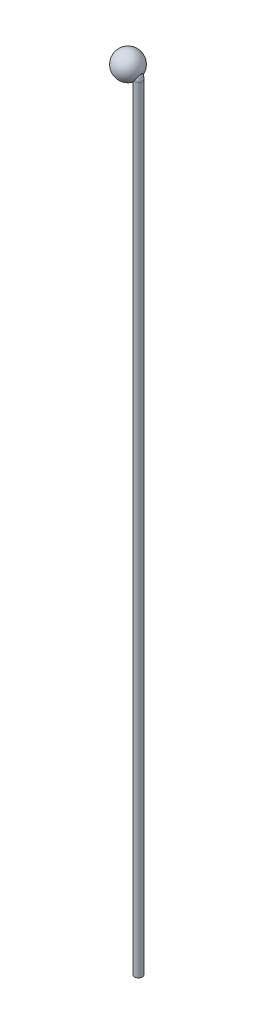
ISO-10303-21;
HEADER;
FILE_DESCRIPTION(('STEP AP214'),'2;1');
FILE_NAME('part.step','',(''),(''),'','','');
FILE_SCHEMA(('AUTOMOTIVE_DESIGN { 1 0 10303 214 1 1 1 1 }'));
ENDSEC;
DATA;
#1=APPLICATION_CONTEXT('core data for automotive mechanical design processes');
#2=APPLICATION_PROTOCOL_DEFINITION('international standard','automotive_design',2000,#1);
#3=PRODUCT_CONTEXT('',#1,'mechanical');
#4=PRODUCT('Part','Part','',(#3));
#5=PRODUCT_RELATED_PRODUCT_CATEGORY('part','',(#4));
#6=PRODUCT_DEFINITION_FORMATION('','',#4);
#7=PRODUCT_DEFINITION_CONTEXT('part definition',#1,'design');
#8=PRODUCT_DEFINITION('design','',#6,#7);
#9=PRODUCT_DEFINITION_SHAPE('','',#8);
#10=(LENGTH_UNIT() NAMED_UNIT(*) SI_UNIT(.MILLI.,.METRE.));
#11=(NAMED_UNIT(*) PLANE_ANGLE_UNIT() SI_UNIT($,.RADIAN.));
#12=(NAMED_UNIT(*) SI_UNIT($,.STERADIAN.) SOLID_ANGLE_UNIT());
#13=UNCERTAINTY_MEASURE_WITH_UNIT(LENGTH_MEASURE(1.E-05),#10,'distance_accuracy_value','');
#14=(GEOMETRIC_REPRESENTATION_CONTEXT(3) GLOBAL_UNCERTAINTY_ASSIGNED_CONTEXT((#13)) GLOBAL_UNIT_ASSIGNED_CONTEXT((#10,
#11,#12)) REPRESENTATION_CONTEXT('',''));
#15=CARTESIAN_POINT('',(0.,0.,0.));
#16=DIRECTION('',(0.,0.,1.));
#17=DIRECTION('',(1.,0.,0.));
#18=AXIS2_PLACEMENT_3D('',#15,#16,#17);
#19=CARTESIAN_POINT('',(0.,0.,0.));
#20=DIRECTION('',(0.,1.,0.));
#21=DIRECTION('',(0.,0.,1.));
#22=AXIS2_PLACEMENT_3D('',#19,#20,#21);
#23=SPHERICAL_SURFACE('',#22,0.5);
#24=CARTESIAN_POINT('',(0.371724944797128,-0.300199999999996,0.14731098199243));
#25=CARTESIAN_POINT('',(0.382822604159421,-0.285453656075215,0.149441895341562));
#26=CARTESIAN_POINT('',(0.393473448093939,-0.270017792270245,0.150412919241208));
#27=CARTESIAN_POINT('',(0.41381358598929,-0.238399234661624,0.14925304630718));
#28=CARTESIAN_POINT('',(0.423489987269464,-0.22220985761925,0.147085248421181));
#29=CARTESIAN_POINT('',(0.437939198982227,-0.196511292844039,0.140435275876396));
#30=CARTESIAN_POINT('',(0.443127823333018,-0.186914575035056,0.137221977491605));
#31=CARTESIAN_POINT('',(0.452947449114948,-0.168147484255668,0.129198832263047));
#32=CARTESIAN_POINT('',(0.457580634480911,-0.158975534788162,0.124395537728491));
#33=CARTESIAN_POINT('',(0.465395244524276,-0.143065628103691,0.11412292887103));
#34=CARTESIAN_POINT('',(0.468686101667431,-0.136193350694849,0.108946379697246));
#35=CARTESIAN_POINT('',(0.474767396596466,-0.123244590494415,0.0974208950178393));
#36=CARTESIAN_POINT('',(0.477558100689446,-0.117167684673942,0.0910725870937729));
#37=CARTESIAN_POINT('',(0.482106924185385,-0.107109531752472,0.0784719132724702));
#38=CARTESIAN_POINT('',(0.483960316048988,-0.102947672754769,0.0723985727889181));
#39=CARTESIAN_POINT('',(0.487207119843504,-0.0955862329083156,0.0595790762540797));
#40=CARTESIAN_POINT('',(0.488600764241522,-0.0923861658112945,0.0528332624867263));
#41=CARTESIAN_POINT('',(0.490881289765234,-0.0871176162168309,0.038781693147262));
#42=CARTESIAN_POINT('',(0.491765146955545,-0.0850558890992888,0.0314728820406946));
#43=CARTESIAN_POINT('',(0.492971388137335,-0.082235918520191,0.0165626183668811));
#44=CARTESIAN_POINT('',(0.493294044562607,-0.0814770425944361,0.00896130962489554));
#45=CARTESIAN_POINT('',(0.493358921202744,-0.0813245767499331,-0.00547519177174637));
#46=CARTESIAN_POINT('',(0.49315720129762,-0.0817991236223048,-0.0123091192067306));
#47=CARTESIAN_POINT('',(0.492297952309866,-0.0838112377163295,-0.0257874511068087));
#48=CARTESIAN_POINT('',(0.491640480409389,-0.085348671579932,-0.0324318792390689));
#49=CARTESIAN_POINT('',(0.489905648375127,-0.089375264647601,-0.0452775098161494));
#50=CARTESIAN_POINT('',(0.488833297221216,-0.0918530639414657,-0.0514829925998997));
#51=CARTESIAN_POINT('',(0.486304194587112,-0.0976389852405685,-0.0634066739306972));
#52=CARTESIAN_POINT('',(0.484847359129285,-0.100947288633712,-0.0691247656621961));
#53=CARTESIAN_POINT('',(0.481431929755635,-0.108608508372198,-0.080511859781379));
#54=CARTESIAN_POINT('',(0.479438537093611,-0.113031321691716,-0.0861231608750803));
#55=CARTESIAN_POINT('',(0.475089221670713,-0.122527922850691,-0.0966023168879783));
#56=CARTESIAN_POINT('',(0.47273305776697,-0.127602143320666,-0.101469672968653));
#57=CARTESIAN_POINT('',(0.466530882939008,-0.140717224566382,-0.112538935954798));
#58=CARTESIAN_POINT('',(0.462501985537384,-0.149039323613643,-0.11830700628857));
#59=CARTESIAN_POINT('',(0.453879090235272,-0.166302429252843,-0.128280310664544));
#60=CARTESIAN_POINT('',(0.449284038326102,-0.17524457623766,-0.132482569303516));
#61=CARTESIAN_POINT('',(0.437920096546879,-0.19660414212816,-0.140668687817608));
#62=CARTESIAN_POINT('',(0.4309532611815,-0.209142482700967,-0.144061319525673));
#63=CARTESIAN_POINT('',(0.416282818204481,-0.234183193391826,-0.14860465727104));
#64=CARTESIAN_POINT('',(0.408577934670127,-0.246685461274919,-0.149751404529097));
#65=CARTESIAN_POINT('',(0.391354188521681,-0.273063878835956,-0.150205151821262));
#66=CARTESIAN_POINT('',(0.381733492264174,-0.286880788400373,-0.14922557255491));
#67=CARTESIAN_POINT('',(0.371724944797128,-0.300199999999996,-0.14731098199243));
#68=B_SPLINE_CURVE_WITH_KNOTS('',3,(#24,#25,#26,#27,#28,#29,#30,#31,#32,#33,#34,#35,#36,#37,#38,
#39,#40,#41,#42,#43,#44,#45,#46,#47,#48,#49,#50,#51,#52,#53,#54,#55,#56,#57,#58,#59,#60,#61,#62,
#63,#64,#65,#66,#67),.UNSPECIFIED.,.F.,.F.,(4,2,2,2,2,2,2,2,2,2,2,2,2,2,2,2,2,2,2,2,2,4),(0.,
0.0559286193596906,0.11252011703239,0.146527068701997,0.180395588417581,0.207927215306912,
0.235444139112372,0.258127537608202,0.280799448807542,0.30360449675269,0.326398470939676,
0.346858053677707,0.367315069863473,0.387532443525973,0.40775423665186,0.429922442180847,
0.452105447586346,0.484617149078317,0.517190318993025,0.561164221212211,0.605215565905516,
0.655567179801068),.UNSPECIFIED.);
#69=CARTESIAN_POINT('',(0.371875000000182,-0.3,0.147339690426613));
#70=VERTEX_POINT('',#69);
#71=CARTESIAN_POINT('',(0.371875000000003,-0.299999999999996,-0.147339690426579));
#72=VERTEX_POINT('',#71);
#73=EDGE_CURVE('E11',#70,#72,#68,.T.);
#74=ORIENTED_EDGE('',*,*,#73,.T.);
#75=CARTESIAN_POINT('',(0.372024950000011,-0.299799999999985,-0.147368234628424));
#76=CARTESIAN_POINT('',(0.362557229179333,-0.312466216774881,-0.145564987959291));
#77=CARTESIAN_POINT('',(0.352655617079017,-0.324840224721881,-0.142736879103709));
#78=CARTESIAN_POINT('',(0.33256585832858,-0.348691899975591,-0.134438055277296));
#79=CARTESIAN_POINT('',(0.322375652568903,-0.360155473102814,-0.128932727411499));
#80=CARTESIAN_POINT('',(0.306756972986056,-0.377005843058001,-0.11770733273249));
#81=CARTESIAN_POINT('',(0.301133844869374,-0.382915481802874,-0.113058402908101));
#82=CARTESIAN_POINT('',(0.290329656866898,-0.394039087012173,-0.102609234713391));
#83=CARTESIAN_POINT('',(0.285146830301632,-0.399255886084328,-0.0968139415486929));
#84=CARTESIAN_POINT('',(0.276322925635901,-0.407991924314848,-0.0851345208169131));
#85=CARTESIAN_POINT('',(0.272570186275244,-0.411648731361451,-0.0794387442430882));
#86=CARTESIAN_POINT('',(0.265744156245525,-0.418229002132347,-0.0672603246737103));
#87=CARTESIAN_POINT('',(0.262670570783309,-0.421152784107567,-0.0607780249761863));
#88=CARTESIAN_POINT('',(0.257811907368889,-0.425740459249177,-0.0481768661112206));
#89=CARTESIAN_POINT('',(0.25590224733716,-0.427528033295952,-0.0421513666619259));
#90=CARTESIAN_POINT('',(0.252840673229391,-0.430382991902949,-0.0297465732789042));
#91=CARTESIAN_POINT('',(0.2516883249021,-0.431450789200487,-0.0233674843770831));
#92=CARTESIAN_POINT('',(0.25021925778635,-0.432810668817338,-0.010409891001847));
#93=CARTESIAN_POINT('',(0.249905234907148,-0.433100248543725,-0.00383081182236595));
#94=CARTESIAN_POINT('',(0.250144585056366,-0.432879132937639,0.00929794053894134));
#95=CARTESIAN_POINT('',(0.250697946596721,-0.432368448204262,0.0158476141090777));
#96=CARTESIAN_POINT('',(0.252579205075316,-0.430624345914729,0.0283752461836604));
#97=CARTESIAN_POINT('',(0.253865059033924,-0.429430143898839,0.0343651872411879));
#98=CARTESIAN_POINT('',(0.257097917001114,-0.426408181017929,0.0459939988402054));
#99=CARTESIAN_POINT('',(0.259045018334061,-0.424580326889274,0.0516328175578056));
#100=CARTESIAN_POINT('',(0.263655151712244,-0.420215356441181,0.0628441579976687));
#101=CARTESIAN_POINT('',(0.266359166395241,-0.417637130596193,0.0683836126097057));
#102=CARTESIAN_POINT('',(0.272271584231324,-0.411935529897422,0.0788784516230678));
#103=CARTESIAN_POINT('',(0.275480254159685,-0.408811866612907,0.0838335246653673));
#104=CARTESIAN_POINT('',(0.283984031870943,-0.400422261091581,0.0954732029849072));
#105=CARTESIAN_POINT('',(0.28951780914583,-0.394868179615807,0.101776978858635));
#106=CARTESIAN_POINT('',(0.301082618517469,-0.382974553029783,0.113052768862911));
#107=CARTESIAN_POINT('',(0.30711489243504,-0.376633025274387,0.118021317490433));
#108=CARTESIAN_POINT('',(0.321959833142766,-0.360583288755597,0.128543901959597));
#109=CARTESIAN_POINT('',(0.330883242128965,-0.350573670085847,0.133478528195786));
#110=CARTESIAN_POINT('',(0.348616317718155,-0.329720902024452,0.141257061000954));
#111=CARTESIAN_POINT('',(0.357426010874269,-0.318877951487412,0.144101464650782));
#112=CARTESIAN_POINT('',(0.368026027166739,-0.305100260786705,0.146567133526759));
#113=CARTESIAN_POINT('',(0.370032973004545,-0.302458002645642,0.146989912750776));
#114=CARTESIAN_POINT('',(0.372024950000011,-0.299799999999985,0.147368234628424));
#115=B_SPLINE_CURVE_WITH_KNOTS('',3,(#75,#76,#77,#78,#79,#80,#81,#82,#83,#84,#85,#86,#87,#88,
#89,#90,#91,#92,#93,#94,#95,#96,#97,#98,#99,#100,#101,#102,#103,#104,#105,#106,#107,#108,#109,
#110,#111,#112,#113,#114),.UNSPECIFIED.,.F.,.F.,(4,2,2,2,2,2,2,2,2,2,2,2,2,2,2,2,2,2,2,4),(0.,
0.0479437082087264,0.0965244421193973,0.124603043584271,0.152563061523932,0.175692204871712,
0.198811288988921,0.218433070934081,0.238043591683703,0.257717100925055,0.277390349602994,
0.296034186958824,0.314680769560475,0.334649855271811,0.354629532918048,0.384641202253518,
0.414730028848917,0.457362359437345,0.499984548245024,0.51001698540652),.UNSPECIFIED.);
#116=EDGE_CURVE('E63',#72,#70,#115,.T.);
#117=ORIENTED_EDGE('',*,*,#116,.T.);
#118=EDGE_LOOP('',(#74,#117));
#119=FACE_BOUND('',#118,.T.);
#120=ADVANCED_FACE('F39',(#119),#23,.T.);
#121=CARTESIAN_POINT('',(0.4,-0.3,0.));
#122=DIRECTION('',(0.,-1.,0.));
#123=DIRECTION('',(1.,0.,0.));
#124=AXIS2_PLACEMENT_3D('',#121,#122,#123);
#125=CYLINDRICAL_SURFACE('',#124,0.15);
#126=ORIENTED_EDGE('',*,*,#116,.F.);
#127=CARTESIAN_POINT('',(0.4,-0.3,0.));
#128=DIRECTION('',(0.,-1.,0.));
#129=DIRECTION('',(0.,0.,-1.));
#130=AXIS2_PLACEMENT_3D('',#127,#128,#129);
#131=CIRCLE('',#130,0.15);
#132=EDGE_CURVE('E58',#72,#70,#131,.T.);
#133=ORIENTED_EDGE('',*,*,#132,.T.);
#134=EDGE_LOOP('',(#126,#133));
#135=FACE_BOUND('',#134,.T.);
#136=CARTESIAN_POINT('',(0.400000000000004,-30.,0.));
#137=DIRECTION('',(0.,-1.,0.));
#138=DIRECTION('',(0.,0.,-1.));
#139=AXIS2_PLACEMENT_3D('',#136,#137,#138);
#140=CIRCLE('',#139,0.15);
#141=CARTESIAN_POINT('',(0.400000000000004,-30.,-0.15));
#142=VERTEX_POINT('',#141);
#143=EDGE_CURVE('E52',#142,#142,#140,.T.);
#144=ORIENTED_EDGE('',*,*,#143,.F.);
#145=EDGE_LOOP('',(#144));
#146=FACE_BOUND('',#145,.T.);
#147=ADVANCED_FACE('F41',(#135,#146),#125,.T.);
#148=CARTESIAN_POINT('',(0.1,-0.3,0.));
#149=DIRECTION('',(0.,0.,-1.));
#150=DIRECTION('',(-1.,0.,0.));
#151=AXIS2_PLACEMENT_3D('',#148,#149,#150);
#152=TOROIDAL_SURFACE('',#151,0.3,0.15);
#153=ORIENTED_EDGE('',*,*,#73,.F.);
#154=ORIENTED_EDGE('',*,*,#132,.F.);
#155=EDGE_LOOP('',(#153,#154));
#156=FACE_BOUND('',#155,.T.);
#157=ADVANCED_FACE('F60',(#156),#152,.T.);
#158=CARTESIAN_POINT('',(0.400000000000004,-30.,0.));
#159=DIRECTION('',(0.,-1.,0.));
#160=DIRECTION('',(0.,0.,-1.));
#161=AXIS2_PLACEMENT_3D('',#158,#159,#160);
#162=PLANE('',#161);
#163=ORIENTED_EDGE('',*,*,#143,.T.);
#164=EDGE_LOOP('',(#163));
#165=FACE_BOUND('',#164,.T.);
#166=ADVANCED_FACE('F74',(#165),#162,.T.);
#167=CLOSED_SHELL('',(#120,#147,#157,#166));
#168=MANIFOLD_SOLID_BREP('B2',#167);
#169=ADVANCED_BREP_SHAPE_REPRESENTATION('',(#18,#168),#14);
#170=SHAPE_DEFINITION_REPRESENTATION(#9,#169);
ENDSEC;
END-ISO-10303-21;
